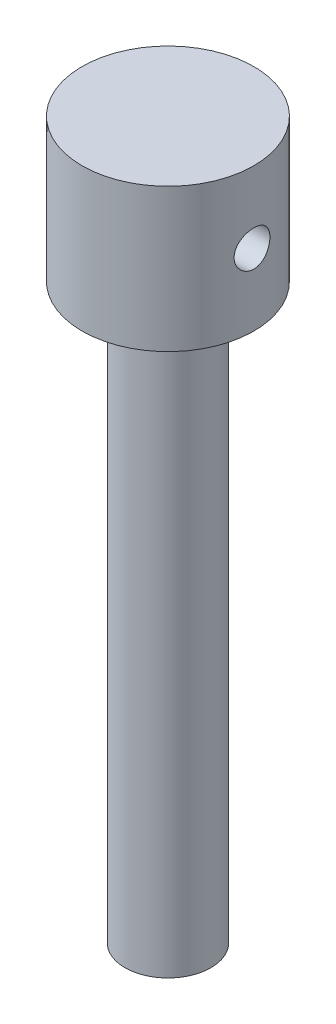
ISO-10303-21;
HEADER;
FILE_DESCRIPTION(('STEP AP214'),'2;1');
FILE_NAME('part.step','',(''),(''),'','','');
FILE_SCHEMA(('AUTOMOTIVE_DESIGN { 1 0 10303 214 1 1 1 1 }'));
ENDSEC;
DATA;
#1=APPLICATION_CONTEXT('core data for automotive mechanical design processes');
#2=APPLICATION_PROTOCOL_DEFINITION('international standard','automotive_design',2000,#1);
#3=PRODUCT_CONTEXT('',#1,'mechanical');
#4=PRODUCT('Part','Part','',(#3));
#5=PRODUCT_RELATED_PRODUCT_CATEGORY('part','',(#4));
#6=PRODUCT_DEFINITION_FORMATION('','',#4);
#7=PRODUCT_DEFINITION_CONTEXT('part definition',#1,'design');
#8=PRODUCT_DEFINITION('design','',#6,#7);
#9=PRODUCT_DEFINITION_SHAPE('','',#8);
#10=(LENGTH_UNIT() NAMED_UNIT(*) SI_UNIT(.MILLI.,.METRE.));
#11=(NAMED_UNIT(*) PLANE_ANGLE_UNIT() SI_UNIT($,.RADIAN.));
#12=(NAMED_UNIT(*) SI_UNIT($,.STERADIAN.) SOLID_ANGLE_UNIT());
#13=UNCERTAINTY_MEASURE_WITH_UNIT(LENGTH_MEASURE(1.E-05),#10,'distance_accuracy_value','');
#14=(GEOMETRIC_REPRESENTATION_CONTEXT(3) GLOBAL_UNCERTAINTY_ASSIGNED_CONTEXT((#13)) GLOBAL_UNIT_ASSIGNED_CONTEXT((#10,
#11,#12)) REPRESENTATION_CONTEXT('',''));
#15=CARTESIAN_POINT('',(0.,0.,0.));
#16=DIRECTION('',(0.,0.,1.));
#17=DIRECTION('',(1.,0.,0.));
#18=AXIS2_PLACEMENT_3D('',#15,#16,#17);
#19=CARTESIAN_POINT('',(0.,-20.,0.));
#20=DIRECTION('',(0.,1.,0.));
#21=DIRECTION('',(0.,0.,1.));
#22=AXIS2_PLACEMENT_3D('',#19,#20,#21);
#23=CYLINDRICAL_SURFACE('',#22,12.);
#24=CARTESIAN_POINT('',(-12.,-7.50000000000001,0.));
#25=CARTESIAN_POINT('',(-11.999997430533,-7.50000495493845,-0.138818083403321));
#26=CARTESIAN_POINT('',(-11.9975665755009,-7.51160133143751,-0.277697579041751));
#27=CARTESIAN_POINT('',(-11.9881040198136,-7.55763869906571,-0.551522632533985));
#28=CARTESIAN_POINT('',(-11.981068823785,-7.59209704607387,-0.686465120256624));
#29=CARTESIAN_POINT('',(-11.963182183924,-7.68274090984365,-0.948418264582681));
#30=CARTESIAN_POINT('',(-11.9523345410529,-7.73890479199778,-1.07543667341837));
#31=CARTESIAN_POINT('',(-11.9279985561972,-7.87129921771237,-1.31824065721191));
#32=CARTESIAN_POINT('',(-11.9145103325195,-7.94752886231166,-1.43402673506865));
#33=CARTESIAN_POINT('',(-11.886154000493,-8.11907268038129,-1.65278064861767));
#34=CARTESIAN_POINT('',(-11.8712701169706,-8.21462400247017,-1.75556048832536));
#35=CARTESIAN_POINT('',(-11.841913153849,-8.42158931839022,-1.94375555353878));
#36=CARTESIAN_POINT('',(-11.8274401083337,-8.53300462374452,-2.02916934192198));
#37=CARTESIAN_POINT('',(-11.8003888519062,-8.76990393753231,-2.18102063354434));
#38=CARTESIAN_POINT('',(-11.7878309034966,-8.89551676900548,-2.24726109361302));
#39=CARTESIAN_POINT('',(-11.7662568130004,-9.15639490354551,-2.35762238696127));
#40=CARTESIAN_POINT('',(-11.7572402893514,-9.29165916488507,-2.40174560335282));
#41=CARTESIAN_POINT('',(-11.7439300197225,-9.56597047483127,-2.46600480267474));
#42=CARTESIAN_POINT('',(-11.7395711371173,-9.70493671866953,-2.48647195393598));
#43=CARTESIAN_POINT('',(-11.7358738143298,-9.98439368572527,-2.50386715311229));
#44=CARTESIAN_POINT('',(-11.7365348160196,-10.1248842377306,-2.50079781789374));
#45=CARTESIAN_POINT('',(-11.7427434863835,-10.4009620559504,-2.47147438074394));
#46=CARTESIAN_POINT('',(-11.748210673598,-10.5365919593224,-2.44560210465441));
#47=CARTESIAN_POINT('',(-11.7632887523188,-10.8015430192899,-2.3720108705989));
#48=CARTESIAN_POINT('',(-11.7728998568263,-10.9308638512127,-2.32429078962763));
#49=CARTESIAN_POINT('',(-11.795263829282,-11.180614456832,-2.20800006427856));
#50=CARTESIAN_POINT('',(-11.8080390757117,-11.3009725930542,-2.13928005068474));
#51=CARTESIAN_POINT('',(-11.8352778002144,-11.5285914885363,-1.98304539854964));
#52=CARTESIAN_POINT('',(-11.8497414879707,-11.6358506176719,-1.89552842452518));
#53=CARTESIAN_POINT('',(-11.8790746185982,-11.8364279221607,-1.70214984309357));
#54=CARTESIAN_POINT('',(-11.8939464639895,-11.929432337794,-1.59596286682418));
#55=CARTESIAN_POINT('',(-11.92216176286,-12.096360884458,-1.36933457722361));
#56=CARTESIAN_POINT('',(-11.9355051934047,-12.1702847291968,-1.24889305005153));
#57=CARTESIAN_POINT('',(-11.9591974188563,-12.2970201630719,-0.996811082470954));
#58=CARTESIAN_POINT('',(-11.9695407942052,-12.3497936091342,-0.865150923852999));
#59=CARTESIAN_POINT('',(-11.9860267642256,-12.432383409671,-0.594569241944308));
#60=CARTESIAN_POINT('',(-11.9921699119211,-12.4622027864628,-0.455648677190175));
#61=CARTESIAN_POINT('',(-11.9994855043091,-12.4975885041358,-0.177183731401664));
#62=CARTESIAN_POINT('',(-12.0007458707516,-12.5035838829885,-0.037696111052351));
#63=CARTESIAN_POINT('',(-11.9983990450555,-12.4923101000618,0.240287597515434));
#64=CARTESIAN_POINT('',(-11.9947921509631,-12.4750423627968,0.378783745924519));
#65=CARTESIAN_POINT('',(-11.9831712995837,-12.4180886930609,0.64945273423963));
#66=CARTESIAN_POINT('',(-11.9752010573615,-12.3786250292331,0.781674385788418));
#67=CARTESIAN_POINT('',(-11.9557445448479,-12.2786442791572,1.03762289332266));
#68=CARTESIAN_POINT('',(-11.9442579948916,-12.218125518268,1.16134907267355));
#69=CARTESIAN_POINT('',(-11.9188248298143,-12.0768392435249,1.39858861388699));
#70=CARTESIAN_POINT('',(-11.9048478762466,-11.9958161408619,1.51194643893968));
#71=CARTESIAN_POINT('',(-11.8760513659942,-11.8161608738475,1.72361089177305));
#72=CARTESIAN_POINT('',(-11.8612317108502,-11.7175266489621,1.82191575582657));
#73=CARTESIAN_POINT('',(-11.8321204906275,-11.5034888460006,2.0023572973036));
#74=CARTESIAN_POINT('',(-11.81784178615,-11.3878339360894,2.0841982920041));
#75=CARTESIAN_POINT('',(-11.7917120203161,-11.1441674315724,2.22729438158488));
#76=CARTESIAN_POINT('',(-11.779860857893,-11.0161563517218,2.28855033355729));
#77=CARTESIAN_POINT('',(-11.7600340141608,-10.7520776074035,2.38834492887844));
#78=CARTESIAN_POINT('',(-11.7520374556937,-10.6160579256683,2.42700619656063));
#79=CARTESIAN_POINT('',(-11.7407836941939,-10.3392668990155,2.48088077046815));
#80=CARTESIAN_POINT('',(-11.7375258132073,-10.1984962367611,2.49609743088882));
#81=CARTESIAN_POINT('',(-11.7361581461701,-9.9191731980007,2.50251852975223));
#82=CARTESIAN_POINT('',(-11.73794804643,-9.78063185955589,2.49419085245451));
#83=CARTESIAN_POINT('',(-11.7462489450986,-9.50697198215955,2.45479810628063));
#84=CARTESIAN_POINT('',(-11.7527598981925,-9.37185341036778,2.42373325564533));
#85=CARTESIAN_POINT('',(-11.7697226489543,-9.10920445621867,2.3399643553717));
#86=CARTESIAN_POINT('',(-11.7801631401586,-8.98165350702614,2.28732235136842));
#87=CARTESIAN_POINT('',(-11.8038141147748,-8.73712244794667,2.16194914599514));
#88=CARTESIAN_POINT('',(-11.8170248553092,-8.62014332073375,2.0892160796606));
#89=CARTESIAN_POINT('',(-11.8450315910229,-8.39775674584111,1.92414739068482));
#90=CARTESIAN_POINT('',(-11.8598522773681,-8.29260175087004,1.83147578083645));
#91=CARTESIAN_POINT('',(-11.8892367916643,-8.09918101354728,1.62984887623066));
#92=CARTESIAN_POINT('',(-11.9038005596976,-8.01091916489702,1.52088983766593));
#93=CARTESIAN_POINT('',(-11.9312288909528,-7.85282285363187,1.2882688550154));
#94=CARTESIAN_POINT('',(-11.9440719214649,-7.78321264022743,1.16445184304269));
#95=CARTESIAN_POINT('',(-11.9663981698818,-7.66589954313996,0.906639687996899));
#96=CARTESIAN_POINT('',(-11.975884323642,-7.61817750563625,0.772653563814482));
#97=CARTESIAN_POINT('',(-11.9886499956289,-7.55491944342315,0.532030585800206));
#98=CARTESIAN_POINT('',(-11.9928807132279,-7.53436247358229,0.426735187455854));
#99=CARTESIAN_POINT('',(-11.9985566557952,-7.50690109144534,0.214305348353071));
#100=CARTESIAN_POINT('',(-12.0000019836917,-7.49999617466562,0.107170975697742));
#101=CARTESIAN_POINT('',(-12.,-7.50000000000001,0.));
#102=B_SPLINE_CURVE_WITH_KNOTS('',3,(#24,#25,#26,#27,#28,#29,#30,#31,#32,#33,#34,#35,#36,#37,
#38,#39,#40,#41,#42,#43,#44,#45,#46,#47,#48,#49,#50,#51,#52,#53,#54,#55,#56,#57,#58,#59,#60,#61,
#62,#63,#64,#65,#66,#67,#68,#69,#70,#71,#72,#73,#74,#75,#76,#77,#78,#79,#80,#81,#82,#83,#84,#85,
#86,#87,#88,#89,#90,#91,#92,#93,#94,#95,#96,#97,#98,#99,#100,#101),.UNSPECIFIED.,.T.,.F.,(4,2,2,
2,2,2,2,2,2,2,2,2,2,2,2,2,2,2,2,2,2,2,2,2,2,2,2,2,2,2,2,2,2,2,2,2,2,2,4),(0.,0.416062090206366,
0.832440399812449,1.24840475765088,1.66435048314597,2.08575052776244,2.50718543103571,
2.93280898357096,3.35838666570979,3.77793150339709,4.1974296953433,4.6100342425812,
5.0226600006056,5.43829184833498,5.85397536736068,6.27779052710931,6.70161204556436,
7.12619448999325,7.55072102091544,7.96756678815352,8.38438703104556,8.79710573265243,
9.20985726781866,9.62803167991474,10.0462550512915,10.4714252765867,10.8965777970262,
11.3194010019005,11.7421637082837,12.1565844658208,12.5710012456272,12.9842346278651,
13.3975063816296,13.8183804966062,14.2393515023474,14.6651772879651,15.0906297292995,
15.4118517695456,15.7330619394678),.UNSPECIFIED.);
#103=CARTESIAN_POINT('',(-12.,-7.50000000000001,0.));
#104=VERTEX_POINT('',#103);
#105=EDGE_CURVE('E10',#104,#104,#102,.T.);
#106=ORIENTED_EDGE('',*,*,#105,.F.);
#107=EDGE_LOOP('',(#106));
#108=FACE_BOUND('',#107,.T.);
#109=CARTESIAN_POINT('',(11.7366945943055,-10.,-2.5));
#110=CARTESIAN_POINT('',(11.7366973843002,-9.86121876969623,-2.499995017553));
#111=CARTESIAN_POINT('',(11.7391829184982,-9.72237605596911,-2.48840458867922));
#112=CARTESIAN_POINT('',(11.7488403116286,-9.44862736536597,-2.44239298467531));
#113=CARTESIAN_POINT('',(11.7560157627658,-9.31372448898727,-2.40795430880678));
#114=CARTESIAN_POINT('',(11.7742058592406,-9.05185525433014,-2.31736795014468));
#115=CARTESIAN_POINT('',(11.7852165141394,-8.92488080801636,-2.26124282497866));
#116=CARTESIAN_POINT('',(11.8098316267143,-8.68215100070883,-2.12893977203463));
#117=CARTESIAN_POINT('',(11.8234359795523,-8.56639518653997,-2.0527626547164));
#118=CARTESIAN_POINT('',(11.8519386932295,-8.34760924969306,-1.88127279893218));
#119=CARTESIAN_POINT('',(11.8668522874608,-8.24477621274707,-1.78571110973934));
#120=CARTESIAN_POINT('',(11.8961593360515,-8.0564778627038,-1.57870244776127));
#121=CARTESIAN_POINT('',(11.9105527521983,-7.97101382341711,-1.46725431091201));
#122=CARTESIAN_POINT('',(11.937362702377,-7.81910822383427,-1.23032410599918));
#123=CARTESIAN_POINT('',(11.9497591726249,-7.75285494707348,-1.10471885640988));
#124=CARTESIAN_POINT('',(11.971006946866,-7.64246789428045,-0.843857102013433));
#125=CARTESIAN_POINT('',(11.9798586112245,-7.59833186969293,-0.708601579901181));
#126=CARTESIAN_POINT('',(11.9929117978436,-7.53404847776505,-0.434325808401005));
#127=CARTESIAN_POINT('',(11.9971778391985,-7.51356796560967,-0.295386761832714));
#128=CARTESIAN_POINT('',(12.0008022516122,-7.49613660848597,-0.0159836976790462));
#129=CARTESIAN_POINT('',(12.0001611340738,-7.49918331161379,0.124480159473679));
#130=CARTESIAN_POINT('',(11.9940931618102,-7.52846920191349,0.400653172399144));
#131=CARTESIAN_POINT('',(11.9887403791317,-7.55434943791624,0.53640225745295));
#132=CARTESIAN_POINT('',(11.9739344179777,-7.62799725066262,0.801587492579504));
#133=CARTESIAN_POINT('',(11.9644810658381,-7.67576575440616,0.931023375022044));
#134=CARTESIAN_POINT('',(11.9424153464785,-7.792160104251,1.18092001076937));
#135=CARTESIAN_POINT('',(11.9297820825069,-7.86092458841932,1.3013142699633));
#136=CARTESIAN_POINT('',(11.9027460088038,-8.01725600568083,1.5289869130213));
#137=CARTESIAN_POINT('',(11.8883429791665,-8.10482527641226,1.63626366363284));
#138=CARTESIAN_POINT('',(11.8590340046655,-8.29824324978211,1.83678840655382));
#139=CARTESIAN_POINT('',(11.8441236995185,-8.40440611996389,1.92973297498958));
#140=CARTESIAN_POINT('',(11.8157374529799,-8.6309640979896,2.09655194480976));
#141=CARTESIAN_POINT('',(11.8022615435432,-8.75135952277446,2.1704259213996));
#142=CARTESIAN_POINT('',(11.7782599681831,-9.00342450965758,2.29712434276909));
#143=CARTESIAN_POINT('',(11.7677417046425,-9.13512130138686,2.34989610979454));
#144=CARTESIAN_POINT('',(11.7509521282072,-9.40578323873877,2.43247155077345));
#145=CARTESIAN_POINT('',(11.7446802101436,-9.54474734561618,2.46227849764698));
#146=CARTESIAN_POINT('',(11.7372156647826,-9.82323941263781,2.49761727734036));
#147=CARTESIAN_POINT('',(11.7359310372695,-9.96270916907406,2.50358885835997));
#148=CARTESIAN_POINT('',(11.7383390403741,-10.2406516230803,2.49227386878588));
#149=CARTESIAN_POINT('',(11.7420313630525,-10.3791243818047,2.47498873715726));
#150=CARTESIAN_POINT('',(11.7538907645233,-10.6496410321163,2.41803116650968));
#151=CARTESIAN_POINT('',(11.76201022566,-10.7817373343577,2.37859682753743));
#152=CARTESIAN_POINT('',(11.7817667700624,-11.0374479788832,2.27871621721838));
#153=CARTESIAN_POINT('',(11.7934041638211,-11.1610615713008,2.21826809112292));
#154=CARTESIAN_POINT('',(11.8190900387438,-11.3982128824325,2.07709196362969));
#155=CARTESIAN_POINT('',(11.8331701329665,-11.5115844089323,1.99609065470793));
#156=CARTESIAN_POINT('',(11.8620696798782,-11.7232864983101,1.81646888113976));
#157=CARTESIAN_POINT('',(11.8768892153306,-11.8216153724785,1.71784644101035));
#158=CARTESIAN_POINT('',(11.9058984863347,-12.0021254261943,1.50380090168668));
#159=CARTESIAN_POINT('',(11.9200734943982,-12.0840081900528,1.38812381522911));
#160=CARTESIAN_POINT('',(11.9459341754481,-12.227177504176,1.14440020443272));
#161=CARTESIAN_POINT('',(11.9576199584164,-12.2884649644749,1.01635422695376));
#162=CARTESIAN_POINT('',(11.9771229654136,-12.3882773586347,0.752284235695838));
#163=CARTESIAN_POINT('',(11.9849632627299,-12.4269383310887,0.616313421940394));
#164=CARTESIAN_POINT('',(11.9959912282046,-12.4808288080162,0.339626801006948));
#165=CARTESIAN_POINT('',(11.9991795068579,-12.4960613870655,0.198911618923387));
#166=CARTESIAN_POINT('',(12.0005281611387,-12.502535244097,-0.080426686940672));
#167=CARTESIAN_POINT('',(11.9987822750957,-12.4942237999895,-0.219039184355823));
#168=CARTESIAN_POINT('',(11.99065748189,-12.4548387226941,-0.492845740747131));
#169=CARTESIAN_POINT('',(11.9842786434588,-12.4237654271863,-0.628039850405493));
#170=CARTESIAN_POINT('',(11.9676092015489,-12.339944410703,-0.890863930984025));
#171=CARTESIAN_POINT('',(11.9573290681437,-12.2872546722944,-1.01851310000874));
#172=CARTESIAN_POINT('',(11.9339599069615,-12.1617552045354,-1.2632211344418));
#173=CARTESIAN_POINT('',(11.9208706346327,-12.0889437233117,-1.38027907656019));
#174=CARTESIAN_POINT('',(11.8930319356995,-11.9237806640155,-1.60268064259534));
#175=CARTESIAN_POINT('',(11.8782576059507,-11.8311114238945,-1.7077852672274));
#176=CARTESIAN_POINT('',(11.8488557363333,-11.6295109979979,-1.90110548396524));
#177=CARTESIAN_POINT('',(11.8342282323044,-11.5205759400736,-1.98931704315914));
#178=CARTESIAN_POINT('',(11.8065838324643,-11.287981795159,-2.14734903704121));
#179=CARTESIAN_POINT('',(11.7935881325424,-11.1641631771794,-2.21693856248136));
#180=CARTESIAN_POINT('',(11.7709407916825,-10.9063496879379,-2.3342125584477));
#181=CARTESIAN_POINT('',(11.7612862067076,-10.7723639031215,-2.38191632583499));
#182=CARTESIAN_POINT('',(11.7482800883641,-10.5317874368468,-2.44513108264677));
#183=CARTESIAN_POINT('',(11.7439632719021,-10.4265409268095,-2.46566898011599));
#184=CARTESIAN_POINT('',(11.7381695052653,-10.2142084389624,-2.49310508716551));
#185=CARTESIAN_POINT('',(11.7366924407628,-10.1071225353812,-2.50000384585405));
#186=CARTESIAN_POINT('',(11.7366945943055,-10.,-2.5));
#187=B_SPLINE_CURVE_WITH_KNOTS('',3,(#109,#110,#111,#112,#113,#114,#115,#116,#117,#118,#119,
#120,#121,#122,#123,#124,#125,#126,#127,#128,#129,#130,#131,#132,#133,#134,#135,#136,#137,#138,
#139,#140,#141,#142,#143,#144,#145,#146,#147,#148,#149,#150,#151,#152,#153,#154,#155,#156,#157,
#158,#159,#160,#161,#162,#163,#164,#165,#166,#167,#168,#169,#170,#171,#172,#173,#174,#175,#176,
#177,#178,#179,#180,#181,#182,#183,#184,#185,#186),.UNSPECIFIED.,.T.,.F.,(4,2,2,2,2,2,2,2,2,2,2,
2,2,2,2,2,2,2,2,2,2,2,2,2,2,2,2,2,2,2,2,2,2,2,2,2,2,2,4),(0.,0.415951308142546,
0.832221584834952,1.24806002960547,1.66388166963159,2.08542666935771,2.50700257327749,
2.93258052533689,3.35811520213867,3.7775809771853,4.19700303792679,4.60994682832923,
5.02290810911742,5.438657439559,5.85445848208521,6.27811724489827,6.70178544383256,
7.12650474664976,7.55116350775195,7.96795032019586,8.3847113459305,8.79707572463847,
9.20947650928062,9.62767835869303,10.0459271216437,10.4711891750669,10.8964324351808,
11.3190919929707,11.7416960791916,12.1563258784529,12.5709495266596,12.984468211702,
13.3980229105635,13.8187663795715,14.2396101685507,14.6654530271772,15.0909196914727,
15.4119973517483,15.7330620852562),.UNSPECIFIED.);
#188=CARTESIAN_POINT('',(11.7366945943055,-10.,-2.5));
#189=VERTEX_POINT('',#188);
#190=EDGE_CURVE('E46',#189,#189,#187,.T.);
#191=ORIENTED_EDGE('',*,*,#190,.F.);
#192=EDGE_LOOP('',(#191));
#193=FACE_BOUND('',#192,.T.);
#194=CARTESIAN_POINT('',(0.,-20.,0.));
#195=DIRECTION('',(0.,1.,0.));
#196=DIRECTION('',(0.,0.,1.));
#197=AXIS2_PLACEMENT_3D('',#194,#195,#196);
#198=CIRCLE('',#197,12.);
#199=CARTESIAN_POINT('',(0.,-20.,12.));
#200=VERTEX_POINT('',#199);
#201=EDGE_CURVE('E50',#200,#200,#198,.T.);
#202=ORIENTED_EDGE('',*,*,#201,.T.);
#203=EDGE_LOOP('',(#202));
#204=FACE_BOUND('',#203,.T.);
#205=CARTESIAN_POINT('',(0.,0.,0.));
#206=DIRECTION('',(0.,1.,0.));
#207=DIRECTION('',(0.,0.,1.));
#208=AXIS2_PLACEMENT_3D('',#205,#206,#207);
#209=CIRCLE('',#208,12.);
#210=CARTESIAN_POINT('',(0.,0.,12.));
#211=VERTEX_POINT('',#210);
#212=EDGE_CURVE('E54',#211,#211,#209,.T.);
#213=ORIENTED_EDGE('',*,*,#212,.F.);
#214=EDGE_LOOP('',(#213));
#215=FACE_BOUND('',#214,.T.);
#216=ADVANCED_FACE('F35',(#108,#193,#204,#215),#23,.T.);
#217=CARTESIAN_POINT('',(0.,-20.,0.));
#218=DIRECTION('',(0.,1.,0.));
#219=DIRECTION('',(0.,0.,1.));
#220=AXIS2_PLACEMENT_3D('',#217,#218,#219);
#221=PLANE('',#220);
#222=CARTESIAN_POINT('',(0.,-20.,0.));
#223=DIRECTION('',(0.,1.,0.));
#224=DIRECTION('',(0.,0.,1.));
#225=AXIS2_PLACEMENT_3D('',#222,#223,#224);
#226=CIRCLE('',#225,6.);
#227=CARTESIAN_POINT('',(0.,-20.,6.));
#228=VERTEX_POINT('',#227);
#229=EDGE_CURVE('E91',#228,#228,#226,.T.);
#230=ORIENTED_EDGE('',*,*,#229,.T.);
#231=EDGE_LOOP('',(#230));
#232=FACE_BOUND('',#231,.T.);
#233=ORIENTED_EDGE('',*,*,#201,.F.);
#234=EDGE_LOOP('',(#233));
#235=FACE_BOUND('',#234,.T.);
#236=ADVANCED_FACE('F74',(#232,#235),#221,.F.);
#237=CARTESIAN_POINT('',(0.,0.,0.));
#238=DIRECTION('',(0.,1.,0.));
#239=DIRECTION('',(0.,0.,1.));
#240=AXIS2_PLACEMENT_3D('',#237,#238,#239);
#241=PLANE('',#240);
#242=ORIENTED_EDGE('',*,*,#212,.T.);
#243=EDGE_LOOP('',(#242));
#244=FACE_BOUND('',#243,.T.);
#245=ADVANCED_FACE('F72',(#244),#241,.T.);
#246=CARTESIAN_POINT('',(0.,-100.,0.));
#247=DIRECTION('',(0.,1.,0.));
#248=DIRECTION('',(0.,0.,1.));
#249=AXIS2_PLACEMENT_3D('',#246,#247,#248);
#250=CYLINDRICAL_SURFACE('',#249,6.);
#251=CARTESIAN_POINT('',(0.,-100.,0.));
#252=DIRECTION('',(0.,1.,0.));
#253=DIRECTION('',(0.,0.,1.));
#254=AXIS2_PLACEMENT_3D('',#251,#252,#253);
#255=CIRCLE('',#254,6.);
#256=CARTESIAN_POINT('',(0.,-100.,6.));
#257=VERTEX_POINT('',#256);
#258=EDGE_CURVE('E93',#257,#257,#255,.T.);
#259=ORIENTED_EDGE('',*,*,#258,.T.);
#260=EDGE_LOOP('',(#259));
#261=FACE_BOUND('',#260,.T.);
#262=ORIENTED_EDGE('',*,*,#229,.F.);
#263=EDGE_LOOP('',(#262));
#264=FACE_BOUND('',#263,.T.);
#265=ADVANCED_FACE('F68',(#261,#264),#250,.T.);
#266=CARTESIAN_POINT('',(0.,-100.,0.));
#267=DIRECTION('',(0.,1.,0.));
#268=DIRECTION('',(0.,0.,1.));
#269=AXIS2_PLACEMENT_3D('',#266,#267,#268);
#270=PLANE('',#269);
#271=ORIENTED_EDGE('',*,*,#258,.F.);
#272=EDGE_LOOP('',(#271));
#273=FACE_BOUND('',#272,.T.);
#274=ADVANCED_FACE('F64',(#273),#270,.F.);
#275=CARTESIAN_POINT('',(-12.,-10.,0.));
#276=DIRECTION('',(1.,0.,0.));
#277=DIRECTION('',(0.,0.,-1.));
#278=AXIS2_PLACEMENT_3D('',#275,#276,#277);
#279=CYLINDRICAL_SURFACE('',#278,2.5);
#280=ORIENTED_EDGE('',*,*,#105,.T.);
#281=EDGE_LOOP('',(#280));
#282=FACE_BOUND('',#281,.T.);
#283=ORIENTED_EDGE('',*,*,#190,.T.);
#284=EDGE_LOOP('',(#283));
#285=FACE_BOUND('',#284,.T.);
#286=ADVANCED_FACE('F60',(#282,#285),#279,.F.);
#287=CLOSED_SHELL('',(#216,#236,#245,#265,#274,#286));
#288=MANIFOLD_SOLID_BREP('B2',#287);
#289=ADVANCED_BREP_SHAPE_REPRESENTATION('',(#18,#288),#14);
#290=SHAPE_DEFINITION_REPRESENTATION(#9,#289);
ENDSEC;
END-ISO-10303-21;
